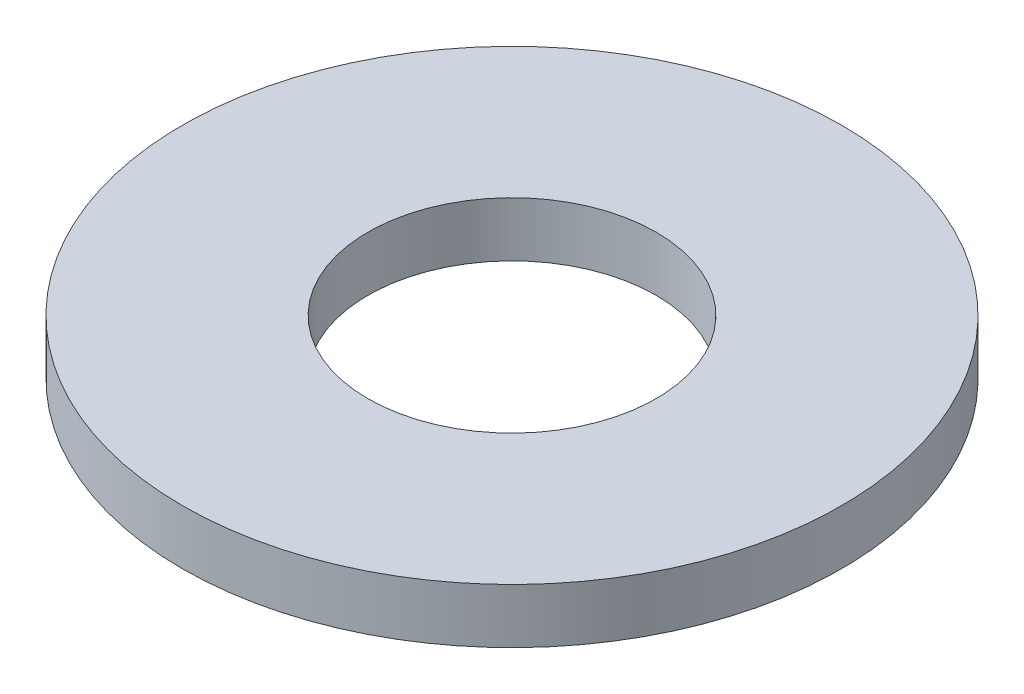
ISO-10303-21;
HEADER;
FILE_DESCRIPTION(('STEP AP214'),'2;1');
FILE_NAME('part.step','',(''),(''),'','','');
FILE_SCHEMA(('AUTOMOTIVE_DESIGN { 1 0 10303 214 1 1 1 1 }'));
ENDSEC;
DATA;
#1=APPLICATION_CONTEXT('core data for automotive mechanical design processes');
#2=APPLICATION_PROTOCOL_DEFINITION('international standard','automotive_design',2000,#1);
#3=PRODUCT_CONTEXT('',#1,'mechanical');
#4=PRODUCT('Part','Part','',(#3));
#5=PRODUCT_RELATED_PRODUCT_CATEGORY('part','',(#4));
#6=PRODUCT_DEFINITION_FORMATION('','',#4);
#7=PRODUCT_DEFINITION_CONTEXT('part definition',#1,'design');
#8=PRODUCT_DEFINITION('design','',#6,#7);
#9=PRODUCT_DEFINITION_SHAPE('','',#8);
#10=(LENGTH_UNIT() NAMED_UNIT(*) SI_UNIT(.MILLI.,.METRE.));
#11=(NAMED_UNIT(*) PLANE_ANGLE_UNIT() SI_UNIT($,.RADIAN.));
#12=(NAMED_UNIT(*) SI_UNIT($,.STERADIAN.) SOLID_ANGLE_UNIT());
#13=UNCERTAINTY_MEASURE_WITH_UNIT(LENGTH_MEASURE(1.E-05),#10,'distance_accuracy_value','');
#14=(GEOMETRIC_REPRESENTATION_CONTEXT(3) GLOBAL_UNCERTAINTY_ASSIGNED_CONTEXT((#13)) GLOBAL_UNIT_ASSIGNED_CONTEXT((#10,
#11,#12)) REPRESENTATION_CONTEXT('',''));
#15=CARTESIAN_POINT('',(0.,0.,0.));
#16=DIRECTION('',(0.,0.,1.));
#17=DIRECTION('',(1.,0.,0.));
#18=AXIS2_PLACEMENT_3D('',#15,#16,#17);
#19=CARTESIAN_POINT('',(0.,2.1082,0.));
#20=DIRECTION('',(0.,1.,0.));
#21=DIRECTION('',(0.,0.,1.));
#22=AXIS2_PLACEMENT_3D('',#19,#20,#21);
#23=PLANE('',#22);
#24=CARTESIAN_POINT('',(0.,2.1082,0.));
#25=DIRECTION('',(0.,1.,0.));
#26=DIRECTION('',(0.,0.,1.));
#27=AXIS2_PLACEMENT_3D('',#24,#25,#26);
#28=CIRCLE('',#27,12.7);
#29=CARTESIAN_POINT('',(0.,2.1082,12.7));
#30=VERTEX_POINT('',#29);
#31=EDGE_CURVE('E10',#30,#30,#28,.T.);
#32=ORIENTED_EDGE('',*,*,#31,.T.);
#33=EDGE_LOOP('',(#32));
#34=FACE_BOUND('',#33,.T.);
#35=CARTESIAN_POINT('',(0.,2.1082,0.));
#36=DIRECTION('',(0.,1.,0.));
#37=DIRECTION('',(0.,0.,1.));
#38=AXIS2_PLACEMENT_3D('',#35,#36,#37);
#39=CIRCLE('',#38,5.55625);
#40=CARTESIAN_POINT('',(0.,2.1082,5.55625));
#41=VERTEX_POINT('',#40);
#42=EDGE_CURVE('E50',#41,#41,#39,.T.);
#43=ORIENTED_EDGE('',*,*,#42,.F.);
#44=EDGE_LOOP('',(#43));
#45=FACE_BOUND('',#44,.T.);
#46=ADVANCED_FACE('F39',(#34,#45),#23,.T.);
#47=CARTESIAN_POINT('',(0.,0.,0.));
#48=DIRECTION('',(0.,1.,0.));
#49=DIRECTION('',(0.,0.,1.));
#50=AXIS2_PLACEMENT_3D('',#47,#48,#49);
#51=PLANE('',#50);
#52=CARTESIAN_POINT('',(0.,0.,0.));
#53=DIRECTION('',(0.,1.,0.));
#54=DIRECTION('',(0.,0.,1.));
#55=AXIS2_PLACEMENT_3D('',#52,#53,#54);
#56=CIRCLE('',#55,12.7);
#57=CARTESIAN_POINT('',(0.,0.,12.7));
#58=VERTEX_POINT('',#57);
#59=EDGE_CURVE('E43',#58,#58,#56,.T.);
#60=ORIENTED_EDGE('',*,*,#59,.F.);
#61=EDGE_LOOP('',(#60));
#62=FACE_BOUND('',#61,.T.);
#63=CARTESIAN_POINT('',(0.,0.,0.));
#64=DIRECTION('',(0.,1.,0.));
#65=DIRECTION('',(0.,0.,1.));
#66=AXIS2_PLACEMENT_3D('',#63,#64,#65);
#67=CIRCLE('',#66,5.55625);
#68=CARTESIAN_POINT('',(0.,0.,5.55625));
#69=VERTEX_POINT('',#68);
#70=EDGE_CURVE('E52',#69,#69,#67,.T.);
#71=ORIENTED_EDGE('',*,*,#70,.T.);
#72=EDGE_LOOP('',(#71));
#73=FACE_BOUND('',#72,.T.);
#74=ADVANCED_FACE('F62',(#62,#73),#51,.F.);
#75=CARTESIAN_POINT('',(0.,2.1082,0.));
#76=DIRECTION('',(0.,-1.,0.));
#77=DIRECTION('',(0.,0.,-1.));
#78=AXIS2_PLACEMENT_3D('',#75,#76,#77);
#79=CYLINDRICAL_SURFACE('',#78,12.7);
#80=ORIENTED_EDGE('',*,*,#31,.F.);
#81=EDGE_LOOP('',(#80));
#82=FACE_BOUND('',#81,.T.);
#83=ORIENTED_EDGE('',*,*,#59,.T.);
#84=EDGE_LOOP('',(#83));
#85=FACE_BOUND('',#84,.T.);
#86=ADVANCED_FACE('F41',(#82,#85),#79,.T.);
#87=CARTESIAN_POINT('',(0.,2.1082,0.));
#88=DIRECTION('',(0.,-1.,0.));
#89=DIRECTION('',(0.,0.,-1.));
#90=AXIS2_PLACEMENT_3D('',#87,#88,#89);
#91=CYLINDRICAL_SURFACE('',#90,5.55625);
#92=ORIENTED_EDGE('',*,*,#42,.T.);
#93=EDGE_LOOP('',(#92));
#94=FACE_BOUND('',#93,.T.);
#95=ORIENTED_EDGE('',*,*,#70,.F.);
#96=EDGE_LOOP('',(#95));
#97=FACE_BOUND('',#96,.T.);
#98=ADVANCED_FACE('F58',(#94,#97),#91,.F.);
#99=CLOSED_SHELL('',(#46,#74,#86,#98));
#100=MANIFOLD_SOLID_BREP('B2',#99);
#101=ADVANCED_BREP_SHAPE_REPRESENTATION('',(#18,#100),#14);
#102=SHAPE_DEFINITION_REPRESENTATION(#9,#101);
ENDSEC;
END-ISO-10303-21;
